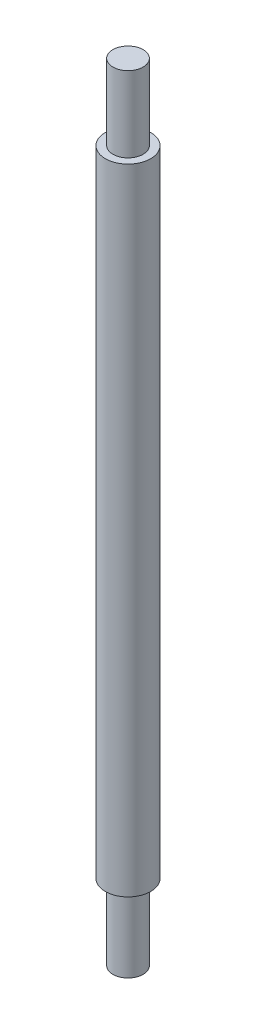
ISO-10303-21;
HEADER;
FILE_DESCRIPTION(('STEP AP214'),'2;1');
FILE_NAME('part.step','',(''),(''),'','','');
FILE_SCHEMA(('AUTOMOTIVE_DESIGN { 1 0 10303 214 1 1 1 1 }'));
ENDSEC;
DATA;
#1=APPLICATION_CONTEXT('core data for automotive mechanical design processes');
#2=APPLICATION_PROTOCOL_DEFINITION('international standard','automotive_design',2000,#1);
#3=PRODUCT_CONTEXT('',#1,'mechanical');
#4=PRODUCT('Part','Part','',(#3));
#5=PRODUCT_RELATED_PRODUCT_CATEGORY('part','',(#4));
#6=PRODUCT_DEFINITION_FORMATION('','',#4);
#7=PRODUCT_DEFINITION_CONTEXT('part definition',#1,'design');
#8=PRODUCT_DEFINITION('design','',#6,#7);
#9=PRODUCT_DEFINITION_SHAPE('','',#8);
#10=(LENGTH_UNIT() NAMED_UNIT(*) SI_UNIT(.MILLI.,.METRE.));
#11=(NAMED_UNIT(*) PLANE_ANGLE_UNIT() SI_UNIT($,.RADIAN.));
#12=(NAMED_UNIT(*) SI_UNIT($,.STERADIAN.) SOLID_ANGLE_UNIT());
#13=UNCERTAINTY_MEASURE_WITH_UNIT(LENGTH_MEASURE(1.E-05),#10,'distance_accuracy_value','');
#14=(GEOMETRIC_REPRESENTATION_CONTEXT(3) GLOBAL_UNCERTAINTY_ASSIGNED_CONTEXT((#13)) GLOBAL_UNIT_ASSIGNED_CONTEXT((#10,
#11,#12)) REPRESENTATION_CONTEXT('',''));
#15=CARTESIAN_POINT('',(0.,0.,0.));
#16=DIRECTION('',(0.,0.,1.));
#17=DIRECTION('',(1.,0.,0.));
#18=AXIS2_PLACEMENT_3D('',#15,#16,#17);
#19=CARTESIAN_POINT('',(1.11022302462516E-13,-42.0000000000002,-1.38777878078145E-13));
#20=DIRECTION('',(0.,1.,0.));
#21=DIRECTION('',(0.,0.,1.00000000000003));
#22=AXIS2_PLACEMENT_3D('',#19,#20,#21);
#23=PLANE('',#22);
#24=CARTESIAN_POINT('',(1.11022302462516E-13,-42.0000000000002,-1.38777878078145E-13));
#25=DIRECTION('',(0.,1.,0.));
#26=DIRECTION('',(0.,0.,1.00000000000003));
#27=AXIS2_PLACEMENT_3D('',#24,#25,#26);
#28=CIRCLE('',#27,3.);
#29=CARTESIAN_POINT('',(2.21878071471338E-13,-42.0000000000002,-2.99999999999988));
#30=VERTEX_POINT('',#29);
#31=EDGE_CURVE('E48',#30,#30,#28,.T.);
#32=ORIENTED_EDGE('',*,*,#31,.F.);
#33=EDGE_LOOP('',(#32));
#34=FACE_BOUND('',#33,.T.);
#35=CARTESIAN_POINT('',(1.11022302462516E-13,-42.0000000000002,-1.38777878078145E-13));
#36=DIRECTION('',(0.,1.,0.));
#37=DIRECTION('',(0.,0.,1.00000000000003));
#38=AXIS2_PLACEMENT_3D('',#35,#36,#37);
#39=CIRCLE('',#38,2.);
#40=CARTESIAN_POINT('',(1.11133324764978E-13,-42.0000000000002,1.99999999999991));
#41=VERTEX_POINT('',#40);
#42=EDGE_CURVE('E10',#41,#41,#39,.F.);
#43=ORIENTED_EDGE('',*,*,#42,.F.);
#44=EDGE_LOOP('',(#43));
#45=FACE_BOUND('',#44,.T.);
#46=ADVANCED_FACE('F37',(#34,#45),#23,.F.);
#47=CARTESIAN_POINT('',(2.22044604925031E-13,41.9999999999991,1.94289029309402E-13));
#48=DIRECTION('',(0.,1.,0.));
#49=DIRECTION('',(0.,0.,1.00000000000003));
#50=AXIS2_PLACEMENT_3D('',#47,#48,#49);
#51=PLANE('',#50);
#52=CARTESIAN_POINT('',(2.22044604925031E-13,41.9999999999991,1.94289029309402E-13));
#53=DIRECTION('',(0.,1.,0.));
#54=DIRECTION('',(0.,0.,1.00000000000003));
#55=AXIS2_PLACEMENT_3D('',#52,#53,#54);
#56=CIRCLE('',#55,3.);
#57=CARTESIAN_POINT('',(2.21878071471338E-13,41.9999999999991,-2.99999999999988));
#58=VERTEX_POINT('',#57);
#59=EDGE_CURVE('E44',#58,#58,#56,.T.);
#60=ORIENTED_EDGE('',*,*,#59,.T.);
#61=EDGE_LOOP('',(#60));
#62=FACE_BOUND('',#61,.T.);
#63=CARTESIAN_POINT('',(2.22044604925031E-13,41.9999999999991,1.94289029309402E-13));
#64=DIRECTION('',(0.,1.,0.));
#65=DIRECTION('',(0.,0.,1.00000000000003));
#66=AXIS2_PLACEMENT_3D('',#63,#64,#65);
#67=CIRCLE('',#66,2.);
#68=CARTESIAN_POINT('',(2.22155627227494E-13,41.9999999999991,2.00000000000025));
#69=VERTEX_POINT('',#68);
#70=EDGE_CURVE('E55',#69,#69,#67,.T.);
#71=ORIENTED_EDGE('',*,*,#70,.F.);
#72=EDGE_LOOP('',(#71));
#73=FACE_BOUND('',#72,.T.);
#74=ADVANCED_FACE('F79',(#62,#73),#51,.T.);
#75=CARTESIAN_POINT('',(2.22044604925031E-13,41.9999999999991,1.94289029309402E-13));
#76=DIRECTION('',(0.,-1.,0.));
#77=DIRECTION('',(0.,0.,-1.00000000000003));
#78=AXIS2_PLACEMENT_3D('',#75,#76,#77);
#79=CYLINDRICAL_SURFACE('',#78,3.);
#80=CARTESIAN_POINT('',(2.21878071471338E-13,41.9999999999991,-2.99999999999988));
#81=CARTESIAN_POINT('',(2.21878071471338E-13,41.1249999999991,-2.99999999999988));
#82=CARTESIAN_POINT('',(2.21878071471338E-13,40.2499999999991,-2.99999999999988));
#83=CARTESIAN_POINT('',(2.21878071471338E-13,38.4999999999992,-2.99999999999988));
#84=CARTESIAN_POINT('',(2.21878071471338E-13,37.6249999999992,-2.99999999999988));
#85=CARTESIAN_POINT('',(2.21878071471338E-13,35.8749999999992,-2.99999999999988));
#86=CARTESIAN_POINT('',(2.21878071471338E-13,34.9999999999992,-2.99999999999988));
#87=CARTESIAN_POINT('',(2.21878071471338E-13,33.2499999999992,-2.99999999999988));
#88=CARTESIAN_POINT('',(2.21878071471338E-13,32.3749999999992,-2.99999999999988));
#89=CARTESIAN_POINT('',(2.21878071471338E-13,30.6249999999992,-2.99999999999988));
#90=CARTESIAN_POINT('',(2.21878071471338E-13,29.7499999999992,-2.99999999999988));
#91=CARTESIAN_POINT('',(2.21878071471338E-13,27.9999999999992,-2.99999999999988));
#92=CARTESIAN_POINT('',(2.21878071471338E-13,27.1249999999992,-2.99999999999988));
#93=CARTESIAN_POINT('',(2.21878071471338E-13,25.3749999999993,-2.99999999999988));
#94=CARTESIAN_POINT('',(2.21878071471338E-13,24.4999999999993,-2.99999999999988));
#95=CARTESIAN_POINT('',(2.21878071471338E-13,22.7499999999993,-2.99999999999988));
#96=CARTESIAN_POINT('',(2.21878071471338E-13,21.8749999999993,-2.99999999999988));
#97=CARTESIAN_POINT('',(2.21878071471338E-13,20.1249999999993,-2.99999999999988));
#98=CARTESIAN_POINT('',(2.21878071471338E-13,19.2499999999993,-2.99999999999988));
#99=CARTESIAN_POINT('',(2.21878071471338E-13,17.4999999999993,-2.99999999999988));
#100=CARTESIAN_POINT('',(2.21878071471338E-13,16.6249999999993,-2.99999999999988));
#101=CARTESIAN_POINT('',(2.21878071471338E-13,14.8749999999993,-2.99999999999988));
#102=CARTESIAN_POINT('',(2.21878071471338E-13,13.9999999999993,-2.99999999999988));
#103=CARTESIAN_POINT('',(2.21878071471338E-13,12.2499999999994,-2.99999999999988));
#104=CARTESIAN_POINT('',(2.21878071471338E-13,11.3749999999994,-2.99999999999988));
#105=CARTESIAN_POINT('',(2.21878071471338E-13,9.62499999999938,-2.99999999999988));
#106=CARTESIAN_POINT('',(2.21878071471338E-13,8.74999999999939,-2.99999999999988));
#107=CARTESIAN_POINT('',(2.21878071471338E-13,6.9999999999994,-2.99999999999988));
#108=CARTESIAN_POINT('',(2.21878071471338E-13,6.12499999999941,-2.99999999999988));
#109=CARTESIAN_POINT('',(2.21878071471338E-13,4.37499999999943,-2.99999999999988));
#110=CARTESIAN_POINT('',(2.21878071471338E-13,3.49999999999943,-2.99999999999988));
#111=CARTESIAN_POINT('',(2.21878071471338E-13,1.74999999999945,-2.99999999999988));
#112=CARTESIAN_POINT('',(2.21878071471338E-13,0.874999999999453,-2.99999999999988));
#113=CARTESIAN_POINT('',(2.21878071471338E-13,-0.875000000000535,-2.99999999999988));
#114=CARTESIAN_POINT('',(2.21878071471338E-13,-1.75000000000053,-2.99999999999988));
#115=CARTESIAN_POINT('',(2.21878071471338E-13,-3.50000000000052,-2.99999999999988));
#116=CARTESIAN_POINT('',(2.21878071471338E-13,-4.37500000000051,-2.99999999999988));
#117=CARTESIAN_POINT('',(2.21878071471338E-13,-6.1250000000005,-2.99999999999988));
#118=CARTESIAN_POINT('',(2.21878071471338E-13,-7.00000000000049,-2.99999999999988));
#119=CARTESIAN_POINT('',(2.21878071471338E-13,-8.75000000000047,-2.99999999999988));
#120=CARTESIAN_POINT('',(2.21878071471338E-13,-9.62500000000047,-2.99999999999988));
#121=CARTESIAN_POINT('',(2.21878071471338E-13,-11.3750000000005,-2.99999999999988));
#122=CARTESIAN_POINT('',(2.21878071471338E-13,-12.2500000000004,-2.99999999999988));
#123=CARTESIAN_POINT('',(2.21878071471338E-13,-14.0000000000004,-2.99999999999988));
#124=CARTESIAN_POINT('',(2.21878071471338E-13,-14.8750000000004,-2.99999999999988));
#125=CARTESIAN_POINT('',(2.21878071471338E-13,-16.6250000000004,-2.99999999999988));
#126=CARTESIAN_POINT('',(2.21878071471338E-13,-17.5000000000004,-2.99999999999988));
#127=CARTESIAN_POINT('',(2.21878071471338E-13,-19.2500000000004,-2.99999999999988));
#128=CARTESIAN_POINT('',(2.21878071471338E-13,-20.1250000000004,-2.99999999999988));
#129=CARTESIAN_POINT('',(2.21878071471338E-13,-21.8750000000004,-2.99999999999988));
#130=CARTESIAN_POINT('',(2.21878071471338E-13,-22.7500000000004,-2.99999999999988));
#131=CARTESIAN_POINT('',(2.21878071471338E-13,-24.5000000000004,-2.99999999999988));
#132=CARTESIAN_POINT('',(2.21878071471338E-13,-25.3750000000003,-2.99999999999988));
#133=CARTESIAN_POINT('',(2.21878071471338E-13,-27.1250000000003,-2.99999999999988));
#134=CARTESIAN_POINT('',(2.21878071471338E-13,-28.0000000000003,-2.99999999999988));
#135=CARTESIAN_POINT('',(2.21878071471338E-13,-29.7500000000003,-2.99999999999988));
#136=CARTESIAN_POINT('',(2.21878071471338E-13,-30.6250000000003,-2.99999999999988));
#137=CARTESIAN_POINT('',(2.21878071471338E-13,-32.3750000000003,-2.99999999999988));
#138=CARTESIAN_POINT('',(2.21878071471338E-13,-33.2500000000003,-2.99999999999988));
#139=CARTESIAN_POINT('',(2.21878071471338E-13,-35.0000000000003,-2.99999999999988));
#140=CARTESIAN_POINT('',(2.21878071471338E-13,-35.8750000000003,-2.99999999999988));
#141=CARTESIAN_POINT('',(2.21878071471338E-13,-37.6250000000002,-2.99999999999988));
#142=CARTESIAN_POINT('',(2.21878071471338E-13,-38.5000000000002,-2.99999999999988));
#143=CARTESIAN_POINT('',(2.21878071471338E-13,-40.2500000000002,-2.99999999999988));
#144=CARTESIAN_POINT('',(2.21878071471338E-13,-41.1250000000002,-2.99999999999988));
#145=CARTESIAN_POINT('',(2.21878071471338E-13,-42.0000000000002,-2.99999999999988));
#146=B_SPLINE_CURVE_WITH_KNOTS('',3,(#80,#81,#82,#83,#84,#85,#86,#87,#88,#89,#90,#91,#92,#93,
#94,#95,#96,#97,#98,#99,#100,#101,#102,#103,#104,#105,#106,#107,#108,#109,#110,#111,#112,#113,
#114,#115,#116,#117,#118,#119,#120,#121,#122,#123,#124,#125,#126,#127,#128,#129,#130,#131,#132,
#133,#134,#135,#136,#137,#138,#139,#140,#141,#142,#143,#144,#145),.UNSPECIFIED.,.F.,.F.,(4,2,2,
2,2,2,2,2,2,2,2,2,2,2,2,2,2,2,2,2,2,2,2,2,2,2,2,2,2,2,2,2,4),(0.,2.62499999999998,
5.24999999999996,7.87499999999994,10.4999999999999,13.1249999999999,15.7499999999999,
18.3749999999999,20.9999999999998,23.6249999999998,26.2499999999998,28.8749999999998,
31.4999999999998,34.1249999999997,36.7499999999997,39.3749999999997,41.9999999999997,
44.6249999999997,47.2499999999996,49.8749999999996,52.4999999999996,55.1249999999996,
57.7499999999995,60.3749999999995,62.9999999999995,65.6249999999995,68.2499999999995,
70.8749999999994,73.4999999999994,76.1249999999994,78.7499999999994,81.3749999999994,
83.9999999999993),.UNSPECIFIED.);
#147=EDGE_CURVE('BSEAM39',#58,#30,#146,.T.);
#148=ORIENTED_EDGE('',*,*,#59,.F.);
#149=ORIENTED_EDGE('',*,*,#31,.T.);
#150=ORIENTED_EDGE('',*,*,#147,.T.);
#151=ORIENTED_EDGE('',*,*,#147,.F.);
#152=EDGE_LOOP('',(#148,#150,#149,#151));
#153=FACE_BOUND('',#152,.T.);
#154=ADVANCED_FACE('F39',(#153),#79,.T.);
#155=CARTESIAN_POINT('',(3.60822483003176E-13,51.9999999999991,-3.88578058618805E-13));
#156=DIRECTION('',(0.,-1.,0.));
#157=DIRECTION('',(0.,0.,-1.00000000000003));
#158=AXIS2_PLACEMENT_3D('',#155,#156,#157);
#159=CYLINDRICAL_SURFACE('',#158,2.);
#160=CARTESIAN_POINT('',(3.60822483003176E-13,51.9999999999991,-3.88578058618805E-13));
#161=DIRECTION('',(0.,1.,0.));
#162=DIRECTION('',(0.,0.,1.00000000000003));
#163=AXIS2_PLACEMENT_3D('',#160,#161,#162);
#164=CIRCLE('',#163,2.);
#165=CARTESIAN_POINT('',(3.60933505305638E-13,51.9999999999991,1.99999999999966));
#166=VERTEX_POINT('',#165);
#167=EDGE_CURVE('E53',#166,#166,#164,.T.);
#168=ORIENTED_EDGE('',*,*,#167,.F.);
#169=EDGE_LOOP('',(#168));
#170=FACE_BOUND('',#169,.T.);
#171=ORIENTED_EDGE('',*,*,#70,.T.);
#172=EDGE_LOOP('',(#171));
#173=FACE_BOUND('',#172,.T.);
#174=ADVANCED_FACE('F75',(#170,#173),#159,.T.);
#175=CARTESIAN_POINT('',(3.60822483003176E-13,51.9999999999991,-3.88578058618805E-13));
#176=DIRECTION('',(0.,1.,0.));
#177=DIRECTION('',(0.,0.,1.00000000000003));
#178=AXIS2_PLACEMENT_3D('',#175,#176,#177);
#179=PLANE('',#178);
#180=ORIENTED_EDGE('',*,*,#167,.T.);
#181=EDGE_LOOP('',(#180));
#182=FACE_BOUND('',#181,.T.);
#183=ADVANCED_FACE('F68',(#182),#179,.T.);
#184=CARTESIAN_POINT('',(5.82867087928207E-13,-52.0000000000002,3.05311331771918E-13));
#185=DIRECTION('',(0.,1.,0.));
#186=DIRECTION('',(0.,0.,1.00000000000003));
#187=AXIS2_PLACEMENT_3D('',#184,#185,#186);
#188=CYLINDRICAL_SURFACE('',#187,2.);
#189=CARTESIAN_POINT('',(5.82867087928207E-13,-52.0000000000002,3.05311331771918E-13));
#190=DIRECTION('',(0.,-1.,0.));
#191=DIRECTION('',(0.,0.,-1.00000000000003));
#192=AXIS2_PLACEMENT_3D('',#189,#190,#191);
#193=CIRCLE('',#192,2.);
#194=CARTESIAN_POINT('',(5.82756065625745E-13,-52.0000000000002,-1.99999999999975));
#195=VERTEX_POINT('',#194);
#196=EDGE_CURVE('E58',#195,#195,#193,.T.);
#197=ORIENTED_EDGE('',*,*,#196,.F.);
#198=EDGE_LOOP('',(#197));
#199=FACE_BOUND('',#198,.T.);
#200=ORIENTED_EDGE('',*,*,#42,.T.);
#201=EDGE_LOOP('',(#200));
#202=FACE_BOUND('',#201,.T.);
#203=ADVANCED_FACE('F66',(#199,#202),#188,.T.);
#204=CARTESIAN_POINT('',(5.82867087928207E-13,-52.0000000000002,3.05311331771918E-13));
#205=DIRECTION('',(0.,-1.,0.));
#206=DIRECTION('',(0.,0.,-1.00000000000003));
#207=AXIS2_PLACEMENT_3D('',#204,#205,#206);
#208=PLANE('',#207);
#209=ORIENTED_EDGE('',*,*,#196,.T.);
#210=EDGE_LOOP('',(#209));
#211=FACE_BOUND('',#210,.T.);
#212=ADVANCED_FACE('F64',(#211),#208,.T.);
#213=CLOSED_SHELL('',(#46,#74,#154,#174,#183,#203,#212));
#214=MANIFOLD_SOLID_BREP('B2',#213);
#215=ADVANCED_BREP_SHAPE_REPRESENTATION('',(#18,#214),#14);
#216=SHAPE_DEFINITION_REPRESENTATION(#9,#215);
ENDSEC;
END-ISO-10303-21;
